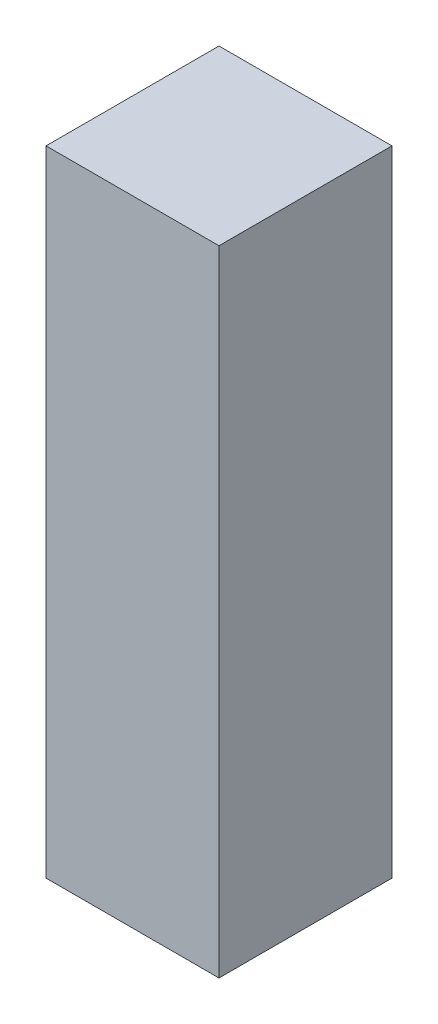
ISO-10303-21;
HEADER;
FILE_DESCRIPTION(('STEP AP214'),'2;1');
FILE_NAME('part.step','',(''),(''),'','','');
FILE_SCHEMA(('AUTOMOTIVE_DESIGN { 1 0 10303 214 1 1 1 1 }'));
ENDSEC;
DATA;
#1=APPLICATION_CONTEXT('core data for automotive mechanical design processes');
#2=APPLICATION_PROTOCOL_DEFINITION('international standard','automotive_design',2000,#1);
#3=PRODUCT_CONTEXT('',#1,'mechanical');
#4=PRODUCT('Part','Part','',(#3));
#5=PRODUCT_RELATED_PRODUCT_CATEGORY('part','',(#4));
#6=PRODUCT_DEFINITION_FORMATION('','',#4);
#7=PRODUCT_DEFINITION_CONTEXT('part definition',#1,'design');
#8=PRODUCT_DEFINITION('design','',#6,#7);
#9=PRODUCT_DEFINITION_SHAPE('','',#8);
#10=(LENGTH_UNIT() NAMED_UNIT(*) SI_UNIT(.MILLI.,.METRE.));
#11=(NAMED_UNIT(*) PLANE_ANGLE_UNIT() SI_UNIT($,.RADIAN.));
#12=(NAMED_UNIT(*) SI_UNIT($,.STERADIAN.) SOLID_ANGLE_UNIT());
#13=UNCERTAINTY_MEASURE_WITH_UNIT(LENGTH_MEASURE(1.E-05),#10,'distance_accuracy_value','');
#14=(GEOMETRIC_REPRESENTATION_CONTEXT(3) GLOBAL_UNCERTAINTY_ASSIGNED_CONTEXT((#13)) GLOBAL_UNIT_ASSIGNED_CONTEXT((#10,
#11,#12)) REPRESENTATION_CONTEXT('',''));
#15=CARTESIAN_POINT('',(0.,0.,0.));
#16=DIRECTION('',(0.,0.,1.));
#17=DIRECTION('',(1.,0.,0.));
#18=AXIS2_PLACEMENT_3D('',#15,#16,#17);
#19=CARTESIAN_POINT('',(320.,560.,-330.));
#20=DIRECTION('',(-1.,0.,0.));
#21=DIRECTION('',(0.,0.,1.));
#22=AXIS2_PLACEMENT_3D('',#19,#20,#21);
#23=PLANE('',#22);
#24=DIRECTION('',(0.,-1.,0.));
#25=VECTOR('',#24,1.);
#26=CARTESIAN_POINT('',(320.,560.,-270.));
#27=LINE('',#26,#25);
#28=CARTESIAN_POINT('',(320.,780.,-270.));
#29=VERTEX_POINT('',#28);
#30=CARTESIAN_POINT('',(320.,560.,-270.));
#31=VERTEX_POINT('',#30);
#32=EDGE_CURVE('E103',#29,#31,#27,.T.);
#33=ORIENTED_EDGE('',*,*,#32,.F.);
#34=DIRECTION('',(0.,0.,1.));
#35=VECTOR('',#34,1.);
#36=CARTESIAN_POINT('',(320.,780.,-330.));
#37=LINE('',#36,#35);
#38=CARTESIAN_POINT('',(320.,780.,-330.));
#39=VERTEX_POINT('',#38);
#40=EDGE_CURVE('E11',#39,#29,#37,.T.);
#41=ORIENTED_EDGE('',*,*,#40,.F.);
#42=DIRECTION('',(0.,-1.,0.));
#43=VECTOR('',#42,1.);
#44=CARTESIAN_POINT('',(320.,560.,-330.));
#45=LINE('',#44,#43);
#46=CARTESIAN_POINT('',(320.,560.,-330.));
#47=VERTEX_POINT('',#46);
#48=EDGE_CURVE('E97',#39,#47,#45,.T.);
#49=ORIENTED_EDGE('',*,*,#48,.T.);
#50=DIRECTION('',(0.,0.,1.));
#51=VECTOR('',#50,1.);
#52=CARTESIAN_POINT('',(320.,560.,-330.));
#53=LINE('',#52,#51);
#54=EDGE_CURVE('E42',#47,#31,#53,.T.);
#55=ORIENTED_EDGE('',*,*,#54,.T.);
#56=EDGE_LOOP('',(#33,#41,#49,#55));
#57=FACE_BOUND('',#56,.T.);
#58=ADVANCED_FACE('F39',(#57),#23,.T.);
#59=CARTESIAN_POINT('',(320.,780.,-330.));
#60=DIRECTION('',(0.,1.,0.));
#61=DIRECTION('',(0.,0.,1.));
#62=AXIS2_PLACEMENT_3D('',#59,#60,#61);
#63=PLANE('',#62);
#64=DIRECTION('',(-1.,0.,0.));
#65=VECTOR('',#64,1.);
#66=CARTESIAN_POINT('',(320.,780.,-270.));
#67=LINE('',#66,#65);
#68=CARTESIAN_POINT('',(380.,780.,-270.));
#69=VERTEX_POINT('',#68);
#70=EDGE_CURVE('E99',#69,#29,#67,.T.);
#71=ORIENTED_EDGE('',*,*,#70,.F.);
#72=DIRECTION('',(0.,0.,1.));
#73=VECTOR('',#72,1.);
#74=CARTESIAN_POINT('',(380.,780.,-330.));
#75=LINE('',#74,#73);
#76=CARTESIAN_POINT('',(380.,780.,-330.));
#77=VERTEX_POINT('',#76);
#78=EDGE_CURVE('E48',#77,#69,#75,.T.);
#79=ORIENTED_EDGE('',*,*,#78,.F.);
#80=DIRECTION('',(-1.,0.,0.));
#81=VECTOR('',#80,1.);
#82=CARTESIAN_POINT('',(320.,780.,-330.));
#83=LINE('',#82,#81);
#84=EDGE_CURVE('E94',#77,#39,#83,.T.);
#85=ORIENTED_EDGE('',*,*,#84,.T.);
#86=ORIENTED_EDGE('',*,*,#40,.T.);
#87=EDGE_LOOP('',(#71,#79,#85,#86));
#88=FACE_BOUND('',#87,.T.);
#89=ADVANCED_FACE('F113',(#88),#63,.T.);
#90=CARTESIAN_POINT('',(380.,560.,-330.));
#91=DIRECTION('',(1.,0.,0.));
#92=DIRECTION('',(0.,0.,-1.));
#93=AXIS2_PLACEMENT_3D('',#90,#91,#92);
#94=PLANE('',#93);
#95=DIRECTION('',(0.,1.,0.));
#96=VECTOR('',#95,1.);
#97=CARTESIAN_POINT('',(380.,560.,-270.));
#98=LINE('',#97,#96);
#99=CARTESIAN_POINT('',(380.,560.,-270.));
#100=VERTEX_POINT('',#99);
#101=EDGE_CURVE('E89',#100,#69,#98,.T.);
#102=ORIENTED_EDGE('',*,*,#101,.F.);
#103=DIRECTION('',(0.,0.,1.));
#104=VECTOR('',#103,1.);
#105=CARTESIAN_POINT('',(380.,560.,-330.));
#106=LINE('',#105,#104);
#107=CARTESIAN_POINT('',(380.,560.,-330.));
#108=VERTEX_POINT('',#107);
#109=EDGE_CURVE('E84',#108,#100,#106,.T.);
#110=ORIENTED_EDGE('',*,*,#109,.F.);
#111=DIRECTION('',(0.,1.,0.));
#112=VECTOR('',#111,1.);
#113=CARTESIAN_POINT('',(380.,560.,-330.));
#114=LINE('',#113,#112);
#115=EDGE_CURVE('E87',#108,#77,#114,.T.);
#116=ORIENTED_EDGE('',*,*,#115,.T.);
#117=ORIENTED_EDGE('',*,*,#78,.T.);
#118=EDGE_LOOP('',(#102,#110,#116,#117));
#119=FACE_BOUND('',#118,.T.);
#120=ADVANCED_FACE('F86',(#119),#94,.T.);
#121=CARTESIAN_POINT('',(320.,560.,-330.));
#122=DIRECTION('',(0.,-1.,0.));
#123=DIRECTION('',(0.,0.,-1.));
#124=AXIS2_PLACEMENT_3D('',#121,#122,#123);
#125=PLANE('',#124);
#126=DIRECTION('',(1.,0.,0.));
#127=VECTOR('',#126,1.);
#128=CARTESIAN_POINT('',(320.,560.,-270.));
#129=LINE('',#128,#127);
#130=EDGE_CURVE('E106',#31,#100,#129,.T.);
#131=ORIENTED_EDGE('',*,*,#130,.F.);
#132=ORIENTED_EDGE('',*,*,#54,.F.);
#133=DIRECTION('',(1.,0.,0.));
#134=VECTOR('',#133,1.);
#135=CARTESIAN_POINT('',(320.,560.,-330.));
#136=LINE('',#135,#134);
#137=EDGE_CURVE('E93',#47,#108,#136,.T.);
#138=ORIENTED_EDGE('',*,*,#137,.T.);
#139=ORIENTED_EDGE('',*,*,#109,.T.);
#140=EDGE_LOOP('',(#131,#132,#138,#139));
#141=FACE_BOUND('',#140,.T.);
#142=ADVANCED_FACE('F96',(#141),#125,.T.);
#143=CARTESIAN_POINT('',(0.,0.,-330.));
#144=DIRECTION('',(0.,0.,-1.));
#145=DIRECTION('',(-1.,0.,0.));
#146=AXIS2_PLACEMENT_3D('',#143,#144,#145);
#147=PLANE('',#146);
#148=ORIENTED_EDGE('',*,*,#48,.F.);
#149=ORIENTED_EDGE('',*,*,#84,.F.);
#150=ORIENTED_EDGE('',*,*,#115,.F.);
#151=ORIENTED_EDGE('',*,*,#137,.F.);
#152=EDGE_LOOP('',(#148,#149,#150,#151));
#153=FACE_BOUND('',#152,.T.);
#154=ADVANCED_FACE('F92',(#153),#147,.T.);
#155=CARTESIAN_POINT('',(0.,0.,-270.));
#156=DIRECTION('',(0.,0.,-1.));
#157=DIRECTION('',(-1.,0.,0.));
#158=AXIS2_PLACEMENT_3D('',#155,#156,#157);
#159=PLANE('',#158);
#160=ORIENTED_EDGE('',*,*,#32,.T.);
#161=ORIENTED_EDGE('',*,*,#130,.T.);
#162=ORIENTED_EDGE('',*,*,#101,.T.);
#163=ORIENTED_EDGE('',*,*,#70,.T.);
#164=EDGE_LOOP('',(#160,#161,#162,#163));
#165=FACE_BOUND('',#164,.T.);
#166=ADVANCED_FACE('F112',(#165),#159,.F.);
#167=CLOSED_SHELL('',(#58,#89,#120,#142,#154,#166));
#168=MANIFOLD_SOLID_BREP('B2',#167);
#169=ADVANCED_BREP_SHAPE_REPRESENTATION('',(#18,#168),#14);
#170=SHAPE_DEFINITION_REPRESENTATION(#9,#169);
ENDSEC;
END-ISO-10303-21;
